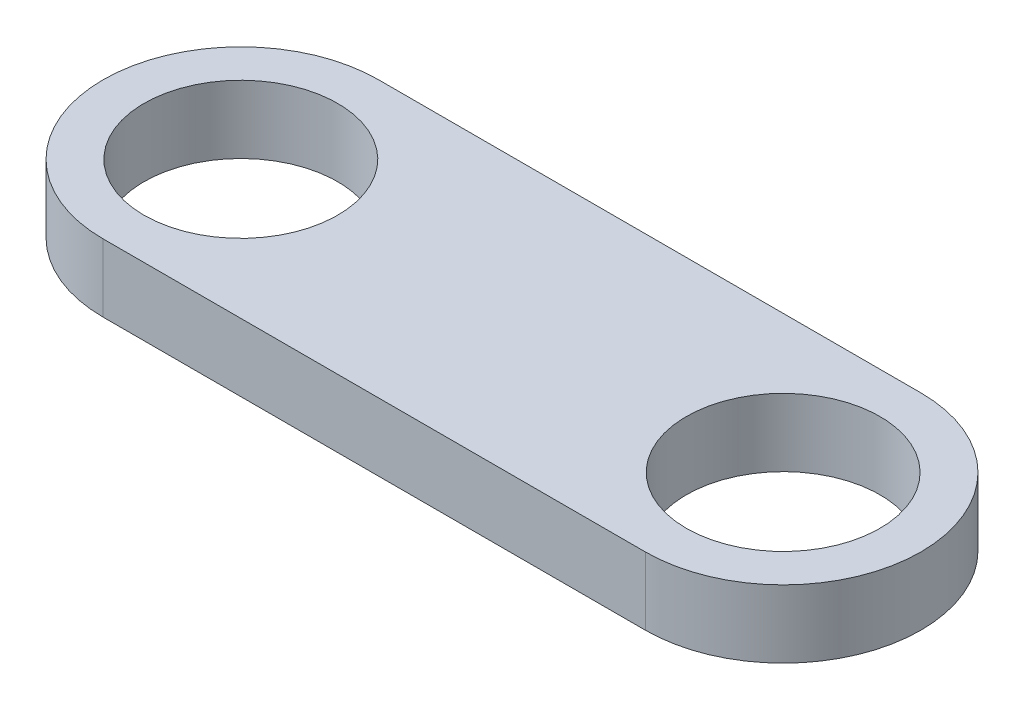
ISO-10303-21;
HEADER;
FILE_DESCRIPTION(('STEP AP214'),'2;1');
FILE_NAME('part.step','',(''),(''),'','','');
FILE_SCHEMA(('AUTOMOTIVE_DESIGN { 1 0 10303 214 1 1 1 1 }'));
ENDSEC;
DATA;
#1=APPLICATION_CONTEXT('core data for automotive mechanical design processes');
#2=APPLICATION_PROTOCOL_DEFINITION('international standard','automotive_design',2000,#1);
#3=PRODUCT_CONTEXT('',#1,'mechanical');
#4=PRODUCT('Part','Part','',(#3));
#5=PRODUCT_RELATED_PRODUCT_CATEGORY('part','',(#4));
#6=PRODUCT_DEFINITION_FORMATION('','',#4);
#7=PRODUCT_DEFINITION_CONTEXT('part definition',#1,'design');
#8=PRODUCT_DEFINITION('design','',#6,#7);
#9=PRODUCT_DEFINITION_SHAPE('','',#8);
#10=(LENGTH_UNIT() NAMED_UNIT(*) SI_UNIT(.MILLI.,.METRE.));
#11=(NAMED_UNIT(*) PLANE_ANGLE_UNIT() SI_UNIT($,.RADIAN.));
#12=(NAMED_UNIT(*) SI_UNIT($,.STERADIAN.) SOLID_ANGLE_UNIT());
#13=UNCERTAINTY_MEASURE_WITH_UNIT(LENGTH_MEASURE(1.E-05),#10,'distance_accuracy_value','');
#14=(GEOMETRIC_REPRESENTATION_CONTEXT(3) GLOBAL_UNCERTAINTY_ASSIGNED_CONTEXT((#13)) GLOBAL_UNIT_ASSIGNED_CONTEXT((#10,
#11,#12)) REPRESENTATION_CONTEXT('',''));
#15=CARTESIAN_POINT('',(0.,0.,0.));
#16=DIRECTION('',(0.,0.,1.));
#17=DIRECTION('',(1.,0.,0.));
#18=AXIS2_PLACEMENT_3D('',#15,#16,#17);
#19=CARTESIAN_POINT('',(-64.,16.002,0.));
#20=DIRECTION('',(0.,1.,0.));
#21=DIRECTION('',(0.,0.,1.));
#22=AXIS2_PLACEMENT_3D('',#19,#20,#21);
#23=PLANE('',#22);
#24=CARTESIAN_POINT('',(-64.,16.002,0.));
#25=DIRECTION('',(0.,1.,0.));
#26=DIRECTION('',(0.,0.,1.));
#27=AXIS2_PLACEMENT_3D('',#24,#25,#26);
#28=CIRCLE('',#27,22.8607168689204);
#29=CARTESIAN_POINT('',(-64.,16.002,22.8607168689204));
#30=VERTEX_POINT('',#29);
#31=EDGE_CURVE('E100',#30,#30,#28,.T.);
#32=ORIENTED_EDGE('',*,*,#31,.F.);
#33=EDGE_LOOP('',(#32));
#34=FACE_BOUND('',#33,.T.);
#35=CARTESIAN_POINT('',(-64.,16.002,0.));
#36=DIRECTION('',(0.,1.,0.));
#37=DIRECTION('',(0.,0.,1.));
#38=AXIS2_PLACEMENT_3D('',#35,#36,#37);
#39=CIRCLE('',#38,32.51538958);
#40=CARTESIAN_POINT('',(-64.,16.002,-32.51538958));
#41=VERTEX_POINT('',#40);
#42=CARTESIAN_POINT('',(-64.,16.002,32.51538958));
#43=VERTEX_POINT('',#42);
#44=EDGE_CURVE('E85',#41,#43,#39,.T.);
#45=ORIENTED_EDGE('',*,*,#44,.T.);
#46=DIRECTION('',(1.,0.,0.));
#47=VECTOR('',#46,1.);
#48=CARTESIAN_POINT('',(-64.,16.002,32.51538958));
#49=LINE('',#48,#47);
#50=CARTESIAN_POINT('',(64.,16.002,32.51538958));
#51=VERTEX_POINT('',#50);
#52=EDGE_CURVE('E80',#43,#51,#49,.T.);
#53=ORIENTED_EDGE('',*,*,#52,.T.);
#54=CARTESIAN_POINT('',(64.,16.002,0.));
#55=DIRECTION('',(0.,1.,0.));
#56=DIRECTION('',(0.,0.,1.));
#57=AXIS2_PLACEMENT_3D('',#54,#55,#56);
#58=CIRCLE('',#57,32.51538958);
#59=CARTESIAN_POINT('',(64.,16.002,-32.51538958));
#60=VERTEX_POINT('',#59);
#61=EDGE_CURVE('E83',#51,#60,#58,.T.);
#62=ORIENTED_EDGE('',*,*,#61,.T.);
#63=DIRECTION('',(-1.,0.,0.));
#64=VECTOR('',#63,1.);
#65=CARTESIAN_POINT('',(-64.,16.002,-32.51538958));
#66=LINE('',#65,#64);
#67=EDGE_CURVE('E50',#60,#41,#66,.T.);
#68=ORIENTED_EDGE('',*,*,#67,.T.);
#69=EDGE_LOOP('',(#45,#53,#62,#68));
#70=FACE_BOUND('',#69,.T.);
#71=CARTESIAN_POINT('',(64.,16.002,0.));
#72=DIRECTION('',(0.,1.,0.));
#73=DIRECTION('',(0.,0.,1.));
#74=AXIS2_PLACEMENT_3D('',#71,#72,#73);
#75=CIRCLE('',#74,22.8607168689204);
#76=CARTESIAN_POINT('',(64.,16.002,22.8607168689204));
#77=VERTEX_POINT('',#76);
#78=EDGE_CURVE('E115',#77,#77,#75,.T.);
#79=ORIENTED_EDGE('',*,*,#78,.F.);
#80=EDGE_LOOP('',(#79));
#81=FACE_BOUND('',#80,.T.);
#82=ADVANCED_FACE('F33',(#34,#70,#81),#23,.T.);
#83=CARTESIAN_POINT('',(-64.,0.,0.));
#84=DIRECTION('',(0.,1.,0.));
#85=DIRECTION('',(0.,0.,1.));
#86=AXIS2_PLACEMENT_3D('',#83,#84,#85);
#87=PLANE('',#86);
#88=CARTESIAN_POINT('',(-64.,0.,0.));
#89=DIRECTION('',(0.,1.,0.));
#90=DIRECTION('',(0.,0.,1.));
#91=AXIS2_PLACEMENT_3D('',#88,#89,#90);
#92=CIRCLE('',#91,32.51538958);
#93=CARTESIAN_POINT('',(-64.,0.,-32.51538958));
#94=VERTEX_POINT('',#93);
#95=CARTESIAN_POINT('',(-64.,0.,32.51538958));
#96=VERTEX_POINT('',#95);
#97=EDGE_CURVE('E97',#94,#96,#92,.T.);
#98=ORIENTED_EDGE('',*,*,#97,.F.);
#99=DIRECTION('',(-1.,0.,0.));
#100=VECTOR('',#99,1.);
#101=CARTESIAN_POINT('',(-64.,0.,-32.51538958));
#102=LINE('',#101,#100);
#103=CARTESIAN_POINT('',(64.,0.,-32.51538958));
#104=VERTEX_POINT('',#103);
#105=EDGE_CURVE('E73',#104,#94,#102,.T.);
#106=ORIENTED_EDGE('',*,*,#105,.F.);
#107=CARTESIAN_POINT('',(64.,0.,0.));
#108=DIRECTION('',(0.,1.,0.));
#109=DIRECTION('',(0.,0.,1.));
#110=AXIS2_PLACEMENT_3D('',#107,#108,#109);
#111=CIRCLE('',#110,32.51538958);
#112=CARTESIAN_POINT('',(64.,0.,32.51538958));
#113=VERTEX_POINT('',#112);
#114=EDGE_CURVE('E67',#113,#104,#111,.T.);
#115=ORIENTED_EDGE('',*,*,#114,.F.);
#116=DIRECTION('',(1.,0.,0.));
#117=VECTOR('',#116,1.);
#118=CARTESIAN_POINT('',(-64.,0.,32.51538958));
#119=LINE('',#118,#117);
#120=EDGE_CURVE('E89',#96,#113,#119,.T.);
#121=ORIENTED_EDGE('',*,*,#120,.F.);
#122=EDGE_LOOP('',(#98,#106,#115,#121));
#123=FACE_BOUND('',#122,.T.);
#124=CARTESIAN_POINT('',(-64.,0.,0.));
#125=DIRECTION('',(0.,1.,0.));
#126=DIRECTION('',(0.,0.,1.));
#127=AXIS2_PLACEMENT_3D('',#124,#125,#126);
#128=CIRCLE('',#127,22.8607168689204);
#129=CARTESIAN_POINT('',(-64.,0.,22.8607168689204));
#130=VERTEX_POINT('',#129);
#131=EDGE_CURVE('E112',#130,#130,#128,.T.);
#132=ORIENTED_EDGE('',*,*,#131,.T.);
#133=EDGE_LOOP('',(#132));
#134=FACE_BOUND('',#133,.T.);
#135=CARTESIAN_POINT('',(64.,0.,0.));
#136=DIRECTION('',(0.,1.,0.));
#137=DIRECTION('',(0.,0.,1.));
#138=AXIS2_PLACEMENT_3D('',#135,#136,#137);
#139=CIRCLE('',#138,22.8607168689204);
#140=CARTESIAN_POINT('',(64.,0.,22.8607168689204));
#141=VERTEX_POINT('',#140);
#142=EDGE_CURVE('E118',#141,#141,#139,.T.);
#143=ORIENTED_EDGE('',*,*,#142,.T.);
#144=EDGE_LOOP('',(#143));
#145=FACE_BOUND('',#144,.T.);
#146=ADVANCED_FACE('F108',(#123,#134,#145),#87,.F.);
#147=CARTESIAN_POINT('',(-64.,16.002,0.));
#148=DIRECTION('',(0.,-1.,0.));
#149=DIRECTION('',(0.,0.,-1.));
#150=AXIS2_PLACEMENT_3D('',#147,#148,#149);
#151=CYLINDRICAL_SURFACE('',#150,32.51538958);
#152=ORIENTED_EDGE('',*,*,#97,.T.);
#153=DIRECTION('',(0.,-1.,0.));
#154=VECTOR('',#153,1.);
#155=CARTESIAN_POINT('',(-64.,16.002,32.51538958));
#156=LINE('',#155,#154);
#157=EDGE_CURVE('E11',#43,#96,#156,.T.);
#158=ORIENTED_EDGE('',*,*,#157,.F.);
#159=ORIENTED_EDGE('',*,*,#44,.F.);
#160=DIRECTION('',(0.,-1.,0.));
#161=VECTOR('',#160,1.);
#162=CARTESIAN_POINT('',(-64.,16.002,-32.51538958));
#163=LINE('',#162,#161);
#164=EDGE_CURVE('E93',#41,#94,#163,.T.);
#165=ORIENTED_EDGE('',*,*,#164,.T.);
#166=EDGE_LOOP('',(#152,#158,#159,#165));
#167=FACE_BOUND('',#166,.T.);
#168=ADVANCED_FACE('F35',(#167),#151,.T.);
#169=CARTESIAN_POINT('',(-64.,16.002,32.51538958));
#170=DIRECTION('',(0.,0.,-1.));
#171=DIRECTION('',(-1.,0.,0.));
#172=AXIS2_PLACEMENT_3D('',#169,#170,#171);
#173=PLANE('',#172);
#174=ORIENTED_EDGE('',*,*,#120,.T.);
#175=DIRECTION('',(0.,-1.,0.));
#176=VECTOR('',#175,1.);
#177=CARTESIAN_POINT('',(64.,16.002,32.51538958));
#178=LINE('',#177,#176);
#179=EDGE_CURVE('E42',#51,#113,#178,.T.);
#180=ORIENTED_EDGE('',*,*,#179,.F.);
#181=ORIENTED_EDGE('',*,*,#52,.F.);
#182=ORIENTED_EDGE('',*,*,#157,.T.);
#183=EDGE_LOOP('',(#174,#180,#181,#182));
#184=FACE_BOUND('',#183,.T.);
#185=ADVANCED_FACE('F88',(#184),#173,.F.);
#186=CARTESIAN_POINT('',(64.,16.002,0.));
#187=DIRECTION('',(0.,-1.,0.));
#188=DIRECTION('',(0.,0.,-1.));
#189=AXIS2_PLACEMENT_3D('',#186,#187,#188);
#190=CYLINDRICAL_SURFACE('',#189,32.51538958);
#191=ORIENTED_EDGE('',*,*,#114,.T.);
#192=DIRECTION('',(0.,-1.,0.));
#193=VECTOR('',#192,1.);
#194=CARTESIAN_POINT('',(64.,16.002,-32.51538958));
#195=LINE('',#194,#193);
#196=EDGE_CURVE('E90',#60,#104,#195,.T.);
#197=ORIENTED_EDGE('',*,*,#196,.F.);
#198=ORIENTED_EDGE('',*,*,#61,.F.);
#199=ORIENTED_EDGE('',*,*,#179,.T.);
#200=EDGE_LOOP('',(#191,#197,#198,#199));
#201=FACE_BOUND('',#200,.T.);
#202=ADVANCED_FACE('F91',(#201),#190,.T.);
#203=CARTESIAN_POINT('',(-64.,16.002,-32.51538958));
#204=DIRECTION('',(0.,0.,1.));
#205=DIRECTION('',(1.,0.,0.));
#206=AXIS2_PLACEMENT_3D('',#203,#204,#205);
#207=PLANE('',#206);
#208=ORIENTED_EDGE('',*,*,#105,.T.);
#209=ORIENTED_EDGE('',*,*,#164,.F.);
#210=ORIENTED_EDGE('',*,*,#67,.F.);
#211=ORIENTED_EDGE('',*,*,#196,.T.);
#212=EDGE_LOOP('',(#208,#209,#210,#211));
#213=FACE_BOUND('',#212,.T.);
#214=ADVANCED_FACE('F105',(#213),#207,.F.);
#215=CARTESIAN_POINT('',(-64.,16.002,0.));
#216=DIRECTION('',(0.,-1.,0.));
#217=DIRECTION('',(0.,0.,-1.));
#218=AXIS2_PLACEMENT_3D('',#215,#216,#217);
#219=CYLINDRICAL_SURFACE('',#218,22.8607168689204);
#220=ORIENTED_EDGE('',*,*,#31,.T.);
#221=EDGE_LOOP('',(#220));
#222=FACE_BOUND('',#221,.T.);
#223=ORIENTED_EDGE('',*,*,#131,.F.);
#224=EDGE_LOOP('',(#223));
#225=FACE_BOUND('',#224,.T.);
#226=ADVANCED_FACE('F135',(#222,#225),#219,.F.);
#227=CARTESIAN_POINT('',(64.,16.002,0.));
#228=DIRECTION('',(0.,-1.,0.));
#229=DIRECTION('',(0.,0.,-1.));
#230=AXIS2_PLACEMENT_3D('',#227,#228,#229);
#231=CYLINDRICAL_SURFACE('',#230,22.8607168689204);
#232=ORIENTED_EDGE('',*,*,#78,.T.);
#233=EDGE_LOOP('',(#232));
#234=FACE_BOUND('',#233,.T.);
#235=ORIENTED_EDGE('',*,*,#142,.F.);
#236=EDGE_LOOP('',(#235));
#237=FACE_BOUND('',#236,.T.);
#238=ADVANCED_FACE('F124',(#234,#237),#231,.F.);
#239=CLOSED_SHELL('',(#82,#146,#168,#185,#202,#214,#226,#238));
#240=MANIFOLD_SOLID_BREP('B2',#239);
#241=ADVANCED_BREP_SHAPE_REPRESENTATION('',(#18,#240),#14);
#242=SHAPE_DEFINITION_REPRESENTATION(#9,#241);
ENDSEC;
END-ISO-10303-21;
